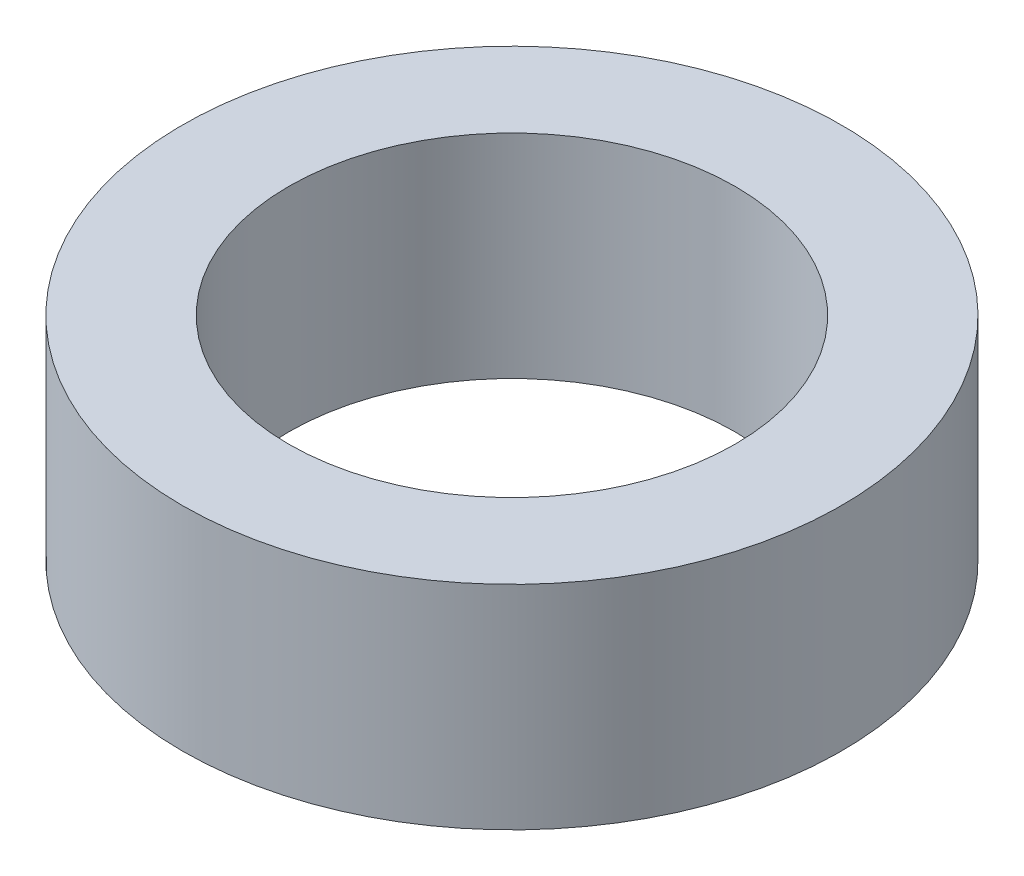
ISO-10303-21;
HEADER;
FILE_DESCRIPTION(('STEP AP214'),'2;1');
FILE_NAME('part.step','',(''),(''),'','','');
FILE_SCHEMA(('AUTOMOTIVE_DESIGN { 1 0 10303 214 1 1 1 1 }'));
ENDSEC;
DATA;
#1=APPLICATION_CONTEXT('core data for automotive mechanical design processes');
#2=APPLICATION_PROTOCOL_DEFINITION('international standard','automotive_design',2000,#1);
#3=PRODUCT_CONTEXT('',#1,'mechanical');
#4=PRODUCT('Part','Part','',(#3));
#5=PRODUCT_RELATED_PRODUCT_CATEGORY('part','',(#4));
#6=PRODUCT_DEFINITION_FORMATION('','',#4);
#7=PRODUCT_DEFINITION_CONTEXT('part definition',#1,'design');
#8=PRODUCT_DEFINITION('design','',#6,#7);
#9=PRODUCT_DEFINITION_SHAPE('','',#8);
#10=(LENGTH_UNIT() NAMED_UNIT(*) SI_UNIT(.MILLI.,.METRE.));
#11=(NAMED_UNIT(*) PLANE_ANGLE_UNIT() SI_UNIT($,.RADIAN.));
#12=(NAMED_UNIT(*) SI_UNIT($,.STERADIAN.) SOLID_ANGLE_UNIT());
#13=UNCERTAINTY_MEASURE_WITH_UNIT(LENGTH_MEASURE(1.E-05),#10,'distance_accuracy_value','');
#14=(GEOMETRIC_REPRESENTATION_CONTEXT(3) GLOBAL_UNCERTAINTY_ASSIGNED_CONTEXT((#13)) GLOBAL_UNIT_ASSIGNED_CONTEXT((#10,
#11,#12)) REPRESENTATION_CONTEXT('',''));
#15=CARTESIAN_POINT('',(0.,0.,0.));
#16=DIRECTION('',(0.,0.,1.));
#17=DIRECTION('',(1.,0.,0.));
#18=AXIS2_PLACEMENT_3D('',#15,#16,#17);
#19=CARTESIAN_POINT('',(0.,2.54,0.));
#20=DIRECTION('',(0.,1.,0.));
#21=DIRECTION('',(0.,0.,1.));
#22=AXIS2_PLACEMENT_3D('',#19,#20,#21);
#23=PLANE('',#22);
#24=CARTESIAN_POINT('',(0.,2.54,0.));
#25=DIRECTION('',(0.,1.,0.));
#26=DIRECTION('',(0.,0.,1.));
#27=AXIS2_PLACEMENT_3D('',#24,#25,#26);
#28=CIRCLE('',#27,3.937);
#29=CARTESIAN_POINT('',(0.,2.54,3.937));
#30=VERTEX_POINT('',#29);
#31=EDGE_CURVE('E10',#30,#30,#28,.T.);
#32=ORIENTED_EDGE('',*,*,#31,.T.);
#33=EDGE_LOOP('',(#32));
#34=FACE_BOUND('',#33,.T.);
#35=CARTESIAN_POINT('',(0.,2.54,0.));
#36=DIRECTION('',(0.,1.,0.));
#37=DIRECTION('',(0.,0.,1.));
#38=AXIS2_PLACEMENT_3D('',#35,#36,#37);
#39=CIRCLE('',#38,2.667);
#40=CARTESIAN_POINT('',(0.,2.54,2.667));
#41=VERTEX_POINT('',#40);
#42=EDGE_CURVE('E45',#41,#41,#39,.T.);
#43=ORIENTED_EDGE('',*,*,#42,.F.);
#44=EDGE_LOOP('',(#43));
#45=FACE_BOUND('',#44,.T.);
#46=ADVANCED_FACE('F34',(#34,#45),#23,.T.);
#47=CARTESIAN_POINT('',(0.,0.,0.));
#48=DIRECTION('',(0.,1.,0.));
#49=DIRECTION('',(0.,0.,1.));
#50=AXIS2_PLACEMENT_3D('',#47,#48,#49);
#51=PLANE('',#50);
#52=CARTESIAN_POINT('',(0.,0.,0.));
#53=DIRECTION('',(0.,1.,0.));
#54=DIRECTION('',(0.,0.,1.));
#55=AXIS2_PLACEMENT_3D('',#52,#53,#54);
#56=CIRCLE('',#55,3.937);
#57=CARTESIAN_POINT('',(0.,0.,3.937));
#58=VERTEX_POINT('',#57);
#59=EDGE_CURVE('E38',#58,#58,#56,.T.);
#60=ORIENTED_EDGE('',*,*,#59,.F.);
#61=EDGE_LOOP('',(#60));
#62=FACE_BOUND('',#61,.T.);
#63=CARTESIAN_POINT('',(0.,0.,0.));
#64=DIRECTION('',(0.,1.,0.));
#65=DIRECTION('',(0.,0.,1.));
#66=AXIS2_PLACEMENT_3D('',#63,#64,#65);
#67=CIRCLE('',#66,2.667);
#68=CARTESIAN_POINT('',(0.,0.,2.667));
#69=VERTEX_POINT('',#68);
#70=EDGE_CURVE('E47',#69,#69,#67,.T.);
#71=ORIENTED_EDGE('',*,*,#70,.T.);
#72=EDGE_LOOP('',(#71));
#73=FACE_BOUND('',#72,.T.);
#74=ADVANCED_FACE('F57',(#62,#73),#51,.F.);
#75=CARTESIAN_POINT('',(0.,2.54,0.));
#76=DIRECTION('',(0.,-1.,0.));
#77=DIRECTION('',(0.,0.,-1.));
#78=AXIS2_PLACEMENT_3D('',#75,#76,#77);
#79=CYLINDRICAL_SURFACE('',#78,3.937);
#80=ORIENTED_EDGE('',*,*,#31,.F.);
#81=EDGE_LOOP('',(#80));
#82=FACE_BOUND('',#81,.T.);
#83=ORIENTED_EDGE('',*,*,#59,.T.);
#84=EDGE_LOOP('',(#83));
#85=FACE_BOUND('',#84,.T.);
#86=ADVANCED_FACE('F36',(#82,#85),#79,.T.);
#87=CARTESIAN_POINT('',(0.,2.54,0.));
#88=DIRECTION('',(0.,-1.,0.));
#89=DIRECTION('',(0.,0.,-1.));
#90=AXIS2_PLACEMENT_3D('',#87,#88,#89);
#91=CYLINDRICAL_SURFACE('',#90,2.667);
#92=ORIENTED_EDGE('',*,*,#42,.T.);
#93=EDGE_LOOP('',(#92));
#94=FACE_BOUND('',#93,.T.);
#95=ORIENTED_EDGE('',*,*,#70,.F.);
#96=EDGE_LOOP('',(#95));
#97=FACE_BOUND('',#96,.T.);
#98=ADVANCED_FACE('F53',(#94,#97),#91,.F.);
#99=CLOSED_SHELL('',(#46,#74,#86,#98));
#100=MANIFOLD_SOLID_BREP('B2',#99);
#101=ADVANCED_BREP_SHAPE_REPRESENTATION('',(#18,#100),#14);
#102=SHAPE_DEFINITION_REPRESENTATION(#9,#101);
ENDSEC;
END-ISO-10303-21;
